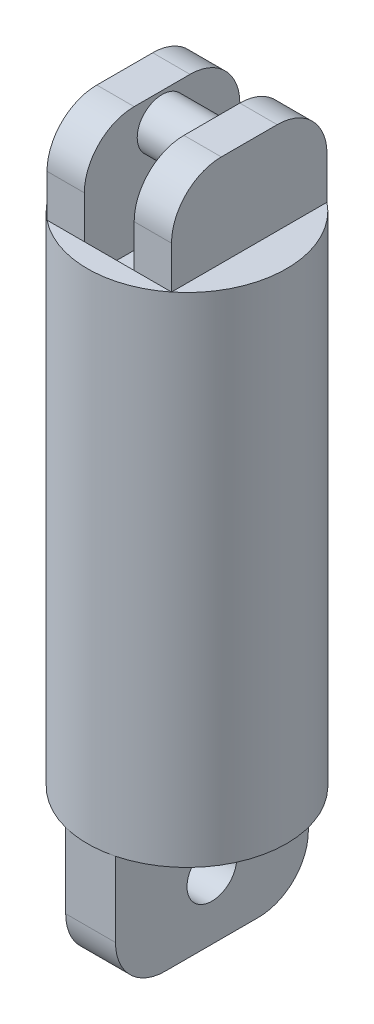
ISO-10303-21;
HEADER;
FILE_DESCRIPTION(('STEP AP214'),'2;1');
FILE_NAME('part.step','',(''),(''),'','','');
FILE_SCHEMA(('AUTOMOTIVE_DESIGN { 1 0 10303 214 1 1 1 1 }'));
ENDSEC;
DATA;
#1=APPLICATION_CONTEXT('core data for automotive mechanical design processes');
#2=APPLICATION_PROTOCOL_DEFINITION('international standard','automotive_design',2000,#1);
#3=PRODUCT_CONTEXT('',#1,'mechanical');
#4=PRODUCT('Part','Part','',(#3));
#5=PRODUCT_RELATED_PRODUCT_CATEGORY('part','',(#4));
#6=PRODUCT_DEFINITION_FORMATION('','',#4);
#7=PRODUCT_DEFINITION_CONTEXT('part definition',#1,'design');
#8=PRODUCT_DEFINITION('design','',#6,#7);
#9=PRODUCT_DEFINITION_SHAPE('','',#8);
#10=(LENGTH_UNIT() NAMED_UNIT(*) SI_UNIT(.MILLI.,.METRE.));
#11=(NAMED_UNIT(*) PLANE_ANGLE_UNIT() SI_UNIT($,.RADIAN.));
#12=(NAMED_UNIT(*) SI_UNIT($,.STERADIAN.) SOLID_ANGLE_UNIT());
#13=UNCERTAINTY_MEASURE_WITH_UNIT(LENGTH_MEASURE(1.E-05),#10,'distance_accuracy_value','');
#14=(GEOMETRIC_REPRESENTATION_CONTEXT(3) GLOBAL_UNCERTAINTY_ASSIGNED_CONTEXT((#13)) GLOBAL_UNIT_ASSIGNED_CONTEXT((#10,
#11,#12)) REPRESENTATION_CONTEXT('',''));
#15=CARTESIAN_POINT('',(0.,0.,0.));
#16=DIRECTION('',(0.,0.,1.));
#17=DIRECTION('',(1.,0.,0.));
#18=AXIS2_PLACEMENT_3D('',#15,#16,#17);
#19=CARTESIAN_POINT('',(0.,0.,0.));
#20=DIRECTION('',(0.,1.,0.));
#21=DIRECTION('',(0.,0.,1.));
#22=AXIS2_PLACEMENT_3D('',#19,#20,#21);
#23=PLANE('',#22);
#24=DIRECTION('',(0.,0.,1.));
#25=VECTOR('',#24,1.);
#26=CARTESIAN_POINT('',(12.7,0.,-49.1868884968342));
#27=LINE('',#26,#25);
#28=CARTESIAN_POINT('',(12.7,0.,-49.1868884968342));
#29=VERTEX_POINT('',#28);
#30=CARTESIAN_POINT('',(12.7,0.,49.1868884968342));
#31=VERTEX_POINT('',#30);
#32=EDGE_CURVE('E226',#29,#31,#27,.T.);
#33=ORIENTED_EDGE('',*,*,#32,.F.);
#34=CARTESIAN_POINT('',(0.,0.,0.));
#35=DIRECTION('',(0.,1.,0.));
#36=DIRECTION('',(0.,0.,1.));
#37=AXIS2_PLACEMENT_3D('',#34,#35,#36);
#38=CIRCLE('',#37,50.8);
#39=EDGE_CURVE('E219',#31,#29,#38,.T.);
#40=ORIENTED_EDGE('',*,*,#39,.F.);
#41=EDGE_LOOP('',(#33,#40));
#42=FACE_BOUND('',#41,.T.);
#43=ADVANCED_FACE('F47',(#42),#23,.F.);
#44=DIRECTION('',(1.,0.,0.));
#45=VECTOR('',#44,1.);
#46=CARTESIAN_POINT('',(-12.7,0.,-49.1868884968342));
#47=LINE('',#46,#45);
#48=CARTESIAN_POINT('',(-12.7,0.,-49.1868884968342));
#49=VERTEX_POINT('',#48);
#50=EDGE_CURVE('E222',#49,#29,#47,.T.);
#51=ORIENTED_EDGE('',*,*,#50,.F.);
#52=EDGE_CURVE('E209',#29,#49,#38,.T.);
#53=ORIENTED_EDGE('',*,*,#52,.F.);
#54=EDGE_LOOP('',(#51,#53));
#55=FACE_BOUND('',#54,.T.);
#56=ADVANCED_FACE('F439',(#55),#23,.F.);
#57=DIRECTION('',(0.,0.,-1.));
#58=VECTOR('',#57,1.);
#59=CARTESIAN_POINT('',(-12.7,0.,-49.1868884968342));
#60=LINE('',#59,#58);
#61=CARTESIAN_POINT('',(-12.7,0.,49.1868884968342));
#62=VERTEX_POINT('',#61);
#63=EDGE_CURVE('E191',#62,#49,#60,.T.);
#64=ORIENTED_EDGE('',*,*,#63,.F.);
#65=EDGE_CURVE('E202',#49,#62,#38,.T.);
#66=ORIENTED_EDGE('',*,*,#65,.F.);
#67=EDGE_LOOP('',(#64,#66));
#68=FACE_BOUND('',#67,.T.);
#69=ADVANCED_FACE('F220',(#68),#23,.F.);
#70=DIRECTION('',(-1.,0.,0.));
#71=VECTOR('',#70,1.);
#72=CARTESIAN_POINT('',(-12.7,0.,49.1868884968342));
#73=LINE('',#72,#71);
#74=EDGE_CURVE('E216',#31,#62,#73,.T.);
#75=ORIENTED_EDGE('',*,*,#74,.F.);
#76=EDGE_CURVE('E206',#62,#31,#38,.T.);
#77=ORIENTED_EDGE('',*,*,#76,.F.);
#78=EDGE_LOOP('',(#75,#77));
#79=FACE_BOUND('',#78,.T.);
#80=ADVANCED_FACE('F215',(#79),#23,.F.);
#81=CARTESIAN_POINT('',(-31.75,300.99,-39.6557372898298));
#82=DIRECTION('',(0.,0.,1.));
#83=DIRECTION('',(1.,0.,0.));
#84=AXIS2_PLACEMENT_3D('',#81,#82,#83);
#85=PLANE('',#84);
#86=DIRECTION('',(0.,1.,0.));
#87=VECTOR('',#86,1.);
#88=CARTESIAN_POINT('',(12.7,237.49,-39.6557372898298));
#89=LINE('',#88,#87);
#90=CARTESIAN_POINT('',(12.7,254.,-39.6557372898298));
#91=VERTEX_POINT('',#90);
#92=CARTESIAN_POINT('',(12.7,275.59,-39.6557372898298));
#93=VERTEX_POINT('',#92);
#94=EDGE_CURVE('E264',#91,#93,#89,.T.);
#95=ORIENTED_EDGE('',*,*,#94,.T.);
#96=DIRECTION('',(-1.,0.,0.));
#97=VECTOR('',#96,1.);
#98=CARTESIAN_POINT('',(-31.75,275.59,-39.6557372898298));
#99=LINE('',#98,#97);
#100=CARTESIAN_POINT('',(31.75,275.59,-39.6557372898298));
#101=VERTEX_POINT('',#100);
#102=EDGE_CURVE('E380',#93,#101,#99,.F.);
#103=ORIENTED_EDGE('',*,*,#102,.T.);
#104=DIRECTION('',(0.,-1.,0.));
#105=VECTOR('',#104,1.);
#106=CARTESIAN_POINT('',(31.75,300.99,-39.6557372898298));
#107=LINE('',#106,#105);
#108=CARTESIAN_POINT('',(31.75,254.,-39.6557372898298));
#109=VERTEX_POINT('',#108);
#110=EDGE_CURVE('E218',#101,#109,#107,.T.);
#111=ORIENTED_EDGE('',*,*,#110,.T.);
#112=DIRECTION('',(-1.,0.,0.));
#113=VECTOR('',#112,1.);
#114=CARTESIAN_POINT('',(-31.75,254.,-39.6557372898298));
#115=LINE('',#114,#113);
#116=EDGE_CURVE('E311',#109,#91,#115,.T.);
#117=ORIENTED_EDGE('',*,*,#116,.T.);
#118=EDGE_LOOP('',(#95,#103,#111,#117));
#119=FACE_BOUND('',#118,.T.);
#120=ADVANCED_FACE('F451',(#119),#85,.F.);
#121=CARTESIAN_POINT('',(-31.75,300.99,39.6557372898298));
#122=DIRECTION('',(0.,0.,-1.));
#123=DIRECTION('',(-1.,0.,0.));
#124=AXIS2_PLACEMENT_3D('',#121,#122,#123);
#125=PLANE('',#124);
#126=DIRECTION('',(0.,-1.,0.));
#127=VECTOR('',#126,1.);
#128=CARTESIAN_POINT('',(31.75,300.99,39.6557372898298));
#129=LINE('',#128,#127);
#130=CARTESIAN_POINT('',(31.75,275.59,39.6557372898298));
#131=VERTEX_POINT('',#130);
#132=CARTESIAN_POINT('',(31.75,254.,39.6557372898298));
#133=VERTEX_POINT('',#132);
#134=EDGE_CURVE('E306',#131,#133,#129,.T.);
#135=ORIENTED_EDGE('',*,*,#134,.F.);
#136=DIRECTION('',(1.,0.,0.));
#137=VECTOR('',#136,1.);
#138=CARTESIAN_POINT('',(-31.75,275.59,39.6557372898298));
#139=LINE('',#138,#137);
#140=CARTESIAN_POINT('',(12.7,275.59,39.6557372898298));
#141=VERTEX_POINT('',#140);
#142=EDGE_CURVE('E389',#131,#141,#139,.F.);
#143=ORIENTED_EDGE('',*,*,#142,.T.);
#144=DIRECTION('',(0.,1.,0.));
#145=VECTOR('',#144,1.);
#146=CARTESIAN_POINT('',(12.7,237.49,39.6557372898298));
#147=LINE('',#146,#145);
#148=CARTESIAN_POINT('',(12.7,254.,39.6557372898298));
#149=VERTEX_POINT('',#148);
#150=EDGE_CURVE('E276',#149,#141,#147,.T.);
#151=ORIENTED_EDGE('',*,*,#150,.F.);
#152=DIRECTION('',(1.,0.,0.));
#153=VECTOR('',#152,1.);
#154=CARTESIAN_POINT('',(-31.75,254.,39.6557372898298));
#155=LINE('',#154,#153);
#156=EDGE_CURVE('E319',#149,#133,#155,.T.);
#157=ORIENTED_EDGE('',*,*,#156,.T.);
#158=EDGE_LOOP('',(#135,#143,#151,#157));
#159=FACE_BOUND('',#158,.T.);
#160=ADVANCED_FACE('F457',(#159),#125,.F.);
#161=CARTESIAN_POINT('',(0.,300.99,0.));
#162=DIRECTION('',(0.,-1.,0.));
#163=DIRECTION('',(0.,0.,-1.));
#164=AXIS2_PLACEMENT_3D('',#161,#162,#163);
#165=PLANE('',#164);
#166=DIRECTION('',(0.,0.,-1.));
#167=VECTOR('',#166,1.);
#168=CARTESIAN_POINT('',(31.75,300.99,39.6557372898298));
#169=LINE('',#168,#167);
#170=CARTESIAN_POINT('',(31.75,300.99,14.2557372898298));
#171=VERTEX_POINT('',#170);
#172=CARTESIAN_POINT('',(31.75,300.99,-14.2557372898298));
#173=VERTEX_POINT('',#172);
#174=EDGE_CURVE('E297',#171,#173,#169,.T.);
#175=ORIENTED_EDGE('',*,*,#174,.T.);
#176=DIRECTION('',(-1.,0.,0.));
#177=VECTOR('',#176,1.);
#178=CARTESIAN_POINT('',(0.,300.99,-14.2557372898298));
#179=LINE('',#178,#177);
#180=CARTESIAN_POINT('',(12.7,300.99,-14.2557372898298));
#181=VERTEX_POINT('',#180);
#182=EDGE_CURVE('E370',#173,#181,#179,.T.);
#183=ORIENTED_EDGE('',*,*,#182,.T.);
#184=DIRECTION('',(0.,0.,-1.));
#185=VECTOR('',#184,1.);
#186=CARTESIAN_POINT('',(12.7,300.99,39.6557372898298));
#187=LINE('',#186,#185);
#188=CARTESIAN_POINT('',(12.7,300.99,14.2557372898298));
#189=VERTEX_POINT('',#188);
#190=EDGE_CURVE('E246',#189,#181,#187,.T.);
#191=ORIENTED_EDGE('',*,*,#190,.F.);
#192=DIRECTION('',(1.,0.,0.));
#193=VECTOR('',#192,1.);
#194=CARTESIAN_POINT('',(0.,300.99,14.2557372898298));
#195=LINE('',#194,#193);
#196=EDGE_CURVE('E366',#189,#171,#195,.T.);
#197=ORIENTED_EDGE('',*,*,#196,.T.);
#198=EDGE_LOOP('',(#175,#183,#191,#197));
#199=FACE_BOUND('',#198,.T.);
#200=ADVANCED_FACE('F616',(#199),#165,.F.);
#201=CARTESIAN_POINT('',(0.,254.,0.));
#202=DIRECTION('',(0.,1.,0.));
#203=DIRECTION('',(0.,0.,1.));
#204=AXIS2_PLACEMENT_3D('',#201,#202,#203);
#205=PLANE('',#204);
#206=DIRECTION('',(0.,0.,-1.));
#207=VECTOR('',#206,1.);
#208=CARTESIAN_POINT('',(31.75,254.,39.6557372898298));
#209=LINE('',#208,#207);
#210=EDGE_CURVE('E296',#133,#109,#209,.T.);
#211=ORIENTED_EDGE('',*,*,#210,.F.);
#212=CARTESIAN_POINT('',(0.,254.,0.));
#213=DIRECTION('',(0.,1.,0.));
#214=DIRECTION('',(0.,0.,1.));
#215=AXIS2_PLACEMENT_3D('',#212,#213,#214);
#216=CIRCLE('',#215,50.8);
#217=EDGE_CURVE('E333',#133,#109,#216,.T.);
#218=ORIENTED_EDGE('',*,*,#217,.T.);
#219=EDGE_LOOP('',(#211,#218));
#220=FACE_BOUND('',#219,.T.);
#221=ADVANCED_FACE('F577',(#220),#205,.T.);
#222=CARTESIAN_POINT('',(-31.75,254.,39.6557372898298));
#223=VERTEX_POINT('',#222);
#224=CARTESIAN_POINT('',(-12.7,254.,39.6557372898298));
#225=VERTEX_POINT('',#224);
#226=EDGE_CURVE('E302',#223,#225,#155,.T.);
#227=ORIENTED_EDGE('',*,*,#226,.F.);
#228=EDGE_CURVE('E338',#223,#133,#216,.T.);
#229=ORIENTED_EDGE('',*,*,#228,.T.);
#230=ORIENTED_EDGE('',*,*,#156,.F.);
#231=DIRECTION('',(1.,0.,0.));
#232=VECTOR('',#231,1.);
#233=CARTESIAN_POINT('',(0.,254.,39.6557372898298));
#234=LINE('',#233,#232);
#235=EDGE_CURVE('E293',#225,#149,#234,.T.);
#236=ORIENTED_EDGE('',*,*,#235,.F.);
#237=EDGE_LOOP('',(#227,#229,#230,#236));
#238=FACE_BOUND('',#237,.T.);
#239=ADVANCED_FACE('F712',(#238),#205,.T.);
#240=DIRECTION('',(0.,0.,1.));
#241=VECTOR('',#240,1.);
#242=CARTESIAN_POINT('',(-31.75,254.,39.6557372898298));
#243=LINE('',#242,#241);
#244=CARTESIAN_POINT('',(-31.75,254.,-39.6557372898298));
#245=VERTEX_POINT('',#244);
#246=EDGE_CURVE('E315',#245,#223,#243,.T.);
#247=ORIENTED_EDGE('',*,*,#246,.F.);
#248=EDGE_CURVE('E783',#245,#223,#216,.T.);
#249=ORIENTED_EDGE('',*,*,#248,.T.);
#250=EDGE_LOOP('',(#247,#249));
#251=FACE_BOUND('',#250,.T.);
#252=ADVANCED_FACE('F705',(#251),#205,.T.);
#253=CARTESIAN_POINT('',(0.,254.,0.));
#254=DIRECTION('',(0.,-1.,0.));
#255=DIRECTION('',(0.,0.,-1.));
#256=AXIS2_PLACEMENT_3D('',#253,#254,#255);
#257=CYLINDRICAL_SURFACE('',#256,50.8);
#258=ORIENTED_EDGE('',*,*,#217,.F.);
#259=ORIENTED_EDGE('',*,*,#228,.F.);
#260=ORIENTED_EDGE('',*,*,#248,.F.);
#261=EDGE_CURVE('E337',#109,#245,#216,.T.);
#262=ORIENTED_EDGE('',*,*,#261,.F.);
#263=EDGE_LOOP('',(#258,#259,#260,#262));
#264=FACE_BOUND('',#263,.T.);
#265=ORIENTED_EDGE('',*,*,#39,.T.);
#266=ORIENTED_EDGE('',*,*,#52,.T.);
#267=ORIENTED_EDGE('',*,*,#65,.T.);
#268=ORIENTED_EDGE('',*,*,#76,.T.);
#269=EDGE_LOOP('',(#265,#266,#267,#268));
#270=FACE_BOUND('',#269,.T.);
#271=ADVANCED_FACE('F205',(#264,#270),#257,.T.);
#272=ORIENTED_EDGE('',*,*,#116,.F.);
#273=ORIENTED_EDGE('',*,*,#261,.T.);
#274=CARTESIAN_POINT('',(-12.7,254.,-39.6557372898298));
#275=VERTEX_POINT('',#274);
#276=EDGE_CURVE('E310',#275,#245,#115,.T.);
#277=ORIENTED_EDGE('',*,*,#276,.F.);
#278=DIRECTION('',(-1.,0.,0.));
#279=VECTOR('',#278,1.);
#280=CARTESIAN_POINT('',(0.,254.,-39.6557372898298));
#281=LINE('',#280,#279);
#282=EDGE_CURVE('E275',#91,#275,#281,.T.);
#283=ORIENTED_EDGE('',*,*,#282,.F.);
#284=EDGE_LOOP('',(#272,#273,#277,#283));
#285=FACE_BOUND('',#284,.T.);
#286=ADVANCED_FACE('F565',(#285),#205,.T.);
#287=CARTESIAN_POINT('',(31.75,300.99,39.6557372898298));
#288=DIRECTION('',(-1.,0.,0.));
#289=DIRECTION('',(0.,0.,1.));
#290=AXIS2_PLACEMENT_3D('',#287,#288,#289);
#291=PLANE('',#290);
#292=ORIENTED_EDGE('',*,*,#110,.F.);
#293=CARTESIAN_POINT('',(31.75,275.59,-14.2557372898298));
#294=DIRECTION('',(-1.,0.,0.));
#295=DIRECTION('',(0.,0.,1.));
#296=AXIS2_PLACEMENT_3D('',#293,#294,#295);
#297=CIRCLE('',#296,25.4);
#298=EDGE_CURVE('E386',#101,#173,#297,.F.);
#299=ORIENTED_EDGE('',*,*,#298,.T.);
#300=ORIENTED_EDGE('',*,*,#174,.F.);
#301=CARTESIAN_POINT('',(31.75,275.59,14.2557372898298));
#302=DIRECTION('',(-1.,0.,0.));
#303=DIRECTION('',(0.,0.,1.));
#304=AXIS2_PLACEMENT_3D('',#301,#302,#303);
#305=CIRCLE('',#304,25.4);
#306=EDGE_CURVE('E383',#171,#131,#305,.F.);
#307=ORIENTED_EDGE('',*,*,#306,.T.);
#308=ORIENTED_EDGE('',*,*,#134,.T.);
#309=ORIENTED_EDGE('',*,*,#210,.T.);
#310=EDGE_LOOP('',(#292,#299,#300,#307,#308,#309));
#311=FACE_BOUND('',#310,.T.);
#312=ADVANCED_FACE('F562',(#311),#291,.F.);
#313=DIRECTION('',(0.,-1.,0.));
#314=VECTOR('',#313,1.);
#315=CARTESIAN_POINT('',(-31.75,300.99,-39.6557372898298));
#316=LINE('',#315,#314);
#317=CARTESIAN_POINT('',(-31.75,275.59,-39.6557372898298));
#318=VERTEX_POINT('',#317);
#319=EDGE_CURVE('E328',#318,#245,#316,.T.);
#320=ORIENTED_EDGE('',*,*,#319,.F.);
#321=DIRECTION('',(-1.,0.,0.));
#322=VECTOR('',#321,1.);
#323=CARTESIAN_POINT('',(-31.75,275.59,-39.6557372898298));
#324=LINE('',#323,#322);
#325=CARTESIAN_POINT('',(-12.7,275.59,-39.6557372898298));
#326=VERTEX_POINT('',#325);
#327=EDGE_CURVE('E354',#318,#326,#324,.F.);
#328=ORIENTED_EDGE('',*,*,#327,.T.);
#329=DIRECTION('',(0.,1.,0.));
#330=VECTOR('',#329,1.);
#331=CARTESIAN_POINT('',(-12.7,237.49,-39.6557372898298));
#332=LINE('',#331,#330);
#333=EDGE_CURVE('E286',#275,#326,#332,.T.);
#334=ORIENTED_EDGE('',*,*,#333,.F.);
#335=ORIENTED_EDGE('',*,*,#276,.T.);
#336=EDGE_LOOP('',(#320,#328,#334,#335));
#337=FACE_BOUND('',#336,.T.);
#338=ADVANCED_FACE('F460',(#337),#85,.F.);
#339=CARTESIAN_POINT('',(-31.75,300.99,39.6557372898298));
#340=DIRECTION('',(1.,0.,0.));
#341=DIRECTION('',(0.,0.,-1.));
#342=AXIS2_PLACEMENT_3D('',#339,#340,#341);
#343=PLANE('',#342);
#344=DIRECTION('',(0.,0.,1.));
#345=VECTOR('',#344,1.);
#346=CARTESIAN_POINT('',(-31.75,300.99,39.6557372898298));
#347=LINE('',#346,#345);
#348=CARTESIAN_POINT('',(-31.75,300.99,-14.2557372898298));
#349=VERTEX_POINT('',#348);
#350=CARTESIAN_POINT('',(-31.75,300.99,14.2557372898298));
#351=VERTEX_POINT('',#350);
#352=EDGE_CURVE('E301',#349,#351,#347,.T.);
#353=ORIENTED_EDGE('',*,*,#352,.F.);
#354=CARTESIAN_POINT('',(-31.75,275.59,-14.2557372898298));
#355=DIRECTION('',(1.,0.,0.));
#356=DIRECTION('',(0.,0.,-1.));
#357=AXIS2_PLACEMENT_3D('',#354,#355,#356);
#358=CIRCLE('',#357,25.4);
#359=EDGE_CURVE('E351',#349,#318,#358,.F.);
#360=ORIENTED_EDGE('',*,*,#359,.T.);
#361=ORIENTED_EDGE('',*,*,#319,.T.);
#362=ORIENTED_EDGE('',*,*,#246,.T.);
#363=DIRECTION('',(0.,-1.,0.));
#364=VECTOR('',#363,1.);
#365=CARTESIAN_POINT('',(-31.75,300.99,39.6557372898298));
#366=LINE('',#365,#364);
#367=CARTESIAN_POINT('',(-31.75,275.59,39.6557372898298));
#368=VERTEX_POINT('',#367);
#369=EDGE_CURVE('E325',#368,#223,#366,.T.);
#370=ORIENTED_EDGE('',*,*,#369,.F.);
#371=CARTESIAN_POINT('',(-31.75,275.59,14.2557372898298));
#372=DIRECTION('',(1.,0.,0.));
#373=DIRECTION('',(0.,0.,-1.));
#374=AXIS2_PLACEMENT_3D('',#371,#372,#373);
#375=CIRCLE('',#374,25.4);
#376=EDGE_CURVE('E348',#368,#351,#375,.F.);
#377=ORIENTED_EDGE('',*,*,#376,.T.);
#378=EDGE_LOOP('',(#353,#360,#361,#362,#370,#377));
#379=FACE_BOUND('',#378,.T.);
#380=ADVANCED_FACE('F585',(#379),#343,.F.);
#381=DIRECTION('',(0.,1.,0.));
#382=VECTOR('',#381,1.);
#383=CARTESIAN_POINT('',(-12.7,237.49,39.6557372898298));
#384=LINE('',#383,#382);
#385=CARTESIAN_POINT('',(-12.7,275.59,39.6557372898298));
#386=VERTEX_POINT('',#385);
#387=EDGE_CURVE('E281',#225,#386,#384,.T.);
#388=ORIENTED_EDGE('',*,*,#387,.T.);
#389=DIRECTION('',(1.,0.,0.));
#390=VECTOR('',#389,1.);
#391=CARTESIAN_POINT('',(-31.75,275.59,39.6557372898298));
#392=LINE('',#391,#390);
#393=EDGE_CURVE('E363',#386,#368,#392,.F.);
#394=ORIENTED_EDGE('',*,*,#393,.T.);
#395=ORIENTED_EDGE('',*,*,#369,.T.);
#396=ORIENTED_EDGE('',*,*,#226,.T.);
#397=EDGE_LOOP('',(#388,#394,#395,#396));
#398=FACE_BOUND('',#397,.T.);
#399=ADVANCED_FACE('F595',(#398),#125,.F.);
#400=DIRECTION('',(0.,0.,1.));
#401=VECTOR('',#400,1.);
#402=CARTESIAN_POINT('',(-12.7,300.99,39.6557372898298));
#403=LINE('',#402,#401);
#404=CARTESIAN_POINT('',(-12.7,300.99,-14.2557372898298));
#405=VERTEX_POINT('',#404);
#406=CARTESIAN_POINT('',(-12.7,300.99,14.2557372898298));
#407=VERTEX_POINT('',#406);
#408=EDGE_CURVE('E252',#405,#407,#403,.T.);
#409=ORIENTED_EDGE('',*,*,#408,.F.);
#410=DIRECTION('',(-1.,0.,0.));
#411=VECTOR('',#410,1.);
#412=CARTESIAN_POINT('',(0.,300.99,-14.2557372898298));
#413=LINE('',#412,#411);
#414=EDGE_CURVE('E344',#405,#349,#413,.T.);
#415=ORIENTED_EDGE('',*,*,#414,.T.);
#416=ORIENTED_EDGE('',*,*,#352,.T.);
#417=DIRECTION('',(1.,0.,0.));
#418=VECTOR('',#417,1.);
#419=CARTESIAN_POINT('',(0.,300.99,14.2557372898298));
#420=LINE('',#419,#418);
#421=EDGE_CURVE('E336',#351,#407,#420,.T.);
#422=ORIENTED_EDGE('',*,*,#421,.T.);
#423=EDGE_LOOP('',(#409,#415,#416,#422));
#424=FACE_BOUND('',#423,.T.);
#425=ADVANCED_FACE('F555',(#424),#165,.F.);
#426=CARTESIAN_POINT('',(12.7,237.49,39.6557372898298));
#427=DIRECTION('',(1.,0.,0.));
#428=DIRECTION('',(0.,0.,-1.));
#429=AXIS2_PLACEMENT_3D('',#426,#427,#428);
#430=PLANE('',#429);
#431=CARTESIAN_POINT('',(12.7,286.494432143543,0.));
#432=DIRECTION('',(1.,0.,0.));
#433=DIRECTION('',(0.,0.,-1.));
#434=AXIS2_PLACEMENT_3D('',#431,#432,#433);
#435=CIRCLE('',#434,12.7);
#436=CARTESIAN_POINT('',(12.7,286.494432143543,-12.7));
#437=VERTEX_POINT('',#436);
#438=EDGE_CURVE('E749',#437,#437,#435,.T.);
#439=ORIENTED_EDGE('',*,*,#438,.T.);
#440=EDGE_LOOP('',(#439));
#441=FACE_BOUND('',#440,.T.);
#442=ORIENTED_EDGE('',*,*,#190,.T.);
#443=CARTESIAN_POINT('',(12.7,275.59,-14.2557372898298));
#444=DIRECTION('',(1.,0.,0.));
#445=DIRECTION('',(0.,0.,-1.));
#446=AXIS2_PLACEMENT_3D('',#443,#444,#445);
#447=CIRCLE('',#446,25.4);
#448=EDGE_CURVE('E377',#181,#93,#447,.F.);
#449=ORIENTED_EDGE('',*,*,#448,.T.);
#450=ORIENTED_EDGE('',*,*,#94,.F.);
#451=CARTESIAN_POINT('',(12.7,237.49,-39.6557372898298));
#452=VERTEX_POINT('',#451);
#453=EDGE_CURVE('E287',#452,#91,#89,.T.);
#454=ORIENTED_EDGE('',*,*,#453,.F.);
#455=DIRECTION('',(0.,0.,-1.));
#456=VECTOR('',#455,1.);
#457=CARTESIAN_POINT('',(12.7,237.49,39.6557372898298));
#458=LINE('',#457,#456);
#459=CARTESIAN_POINT('',(12.7,237.49,39.6557372898298));
#460=VERTEX_POINT('',#459);
#461=EDGE_CURVE('E247',#460,#452,#458,.T.);
#462=ORIENTED_EDGE('',*,*,#461,.F.);
#463=EDGE_CURVE('E271',#460,#149,#147,.T.);
#464=ORIENTED_EDGE('',*,*,#463,.T.);
#465=ORIENTED_EDGE('',*,*,#150,.T.);
#466=CARTESIAN_POINT('',(12.7,275.59,14.2557372898298));
#467=DIRECTION('',(1.,0.,0.));
#468=DIRECTION('',(0.,0.,-1.));
#469=AXIS2_PLACEMENT_3D('',#466,#467,#468);
#470=CIRCLE('',#469,25.4);
#471=EDGE_CURVE('E374',#141,#189,#470,.F.);
#472=ORIENTED_EDGE('',*,*,#471,.T.);
#473=EDGE_LOOP('',(#442,#449,#450,#454,#462,#464,#465,#472));
#474=FACE_BOUND('',#473,.T.);
#475=ADVANCED_FACE('F551',(#441,#474),#430,.F.);
#476=CARTESIAN_POINT('',(-12.7,237.49,39.6557372898298));
#477=DIRECTION('',(0.,0.,1.));
#478=DIRECTION('',(1.,0.,0.));
#479=AXIS2_PLACEMENT_3D('',#476,#477,#478);
#480=PLANE('',#479);
#481=ORIENTED_EDGE('',*,*,#235,.T.);
#482=ORIENTED_EDGE('',*,*,#463,.F.);
#483=DIRECTION('',(1.,0.,0.));
#484=VECTOR('',#483,1.);
#485=CARTESIAN_POINT('',(-12.7,237.49,39.6557372898298));
#486=LINE('',#485,#484);
#487=CARTESIAN_POINT('',(-12.7,237.49,39.6557372898298));
#488=VERTEX_POINT('',#487);
#489=EDGE_CURVE('E260',#488,#460,#486,.T.);
#490=ORIENTED_EDGE('',*,*,#489,.F.);
#491=EDGE_CURVE('E277',#488,#225,#384,.T.);
#492=ORIENTED_EDGE('',*,*,#491,.T.);
#493=EDGE_LOOP('',(#481,#482,#490,#492));
#494=FACE_BOUND('',#493,.T.);
#495=ADVANCED_FACE('F543',(#494),#480,.F.);
#496=CARTESIAN_POINT('',(-12.7,237.49,39.6557372898298));
#497=DIRECTION('',(-1.,0.,0.));
#498=DIRECTION('',(0.,0.,1.));
#499=AXIS2_PLACEMENT_3D('',#496,#497,#498);
#500=PLANE('',#499);
#501=CARTESIAN_POINT('',(-12.7,286.494432143543,0.));
#502=DIRECTION('',(-1.,0.,0.));
#503=DIRECTION('',(0.,0.,1.));
#504=AXIS2_PLACEMENT_3D('',#501,#502,#503);
#505=CIRCLE('',#504,12.7);
#506=CARTESIAN_POINT('',(-12.7,286.494432143543,12.7));
#507=VERTEX_POINT('',#506);
#508=EDGE_CURVE('E51',#507,#507,#505,.T.);
#509=ORIENTED_EDGE('',*,*,#508,.T.);
#510=EDGE_LOOP('',(#509));
#511=FACE_BOUND('',#510,.T.);
#512=ORIENTED_EDGE('',*,*,#333,.T.);
#513=CARTESIAN_POINT('',(-12.7,275.59,-14.2557372898298));
#514=DIRECTION('',(-1.,0.,0.));
#515=DIRECTION('',(0.,0.,1.));
#516=AXIS2_PLACEMENT_3D('',#513,#514,#515);
#517=CIRCLE('',#516,25.4);
#518=EDGE_CURVE('E360',#326,#405,#517,.F.);
#519=ORIENTED_EDGE('',*,*,#518,.T.);
#520=ORIENTED_EDGE('',*,*,#408,.T.);
#521=CARTESIAN_POINT('',(-12.7,275.59,14.2557372898298));
#522=DIRECTION('',(-1.,0.,0.));
#523=DIRECTION('',(0.,0.,1.));
#524=AXIS2_PLACEMENT_3D('',#521,#522,#523);
#525=CIRCLE('',#524,25.4);
#526=EDGE_CURVE('E357',#407,#386,#525,.F.);
#527=ORIENTED_EDGE('',*,*,#526,.T.);
#528=ORIENTED_EDGE('',*,*,#387,.F.);
#529=ORIENTED_EDGE('',*,*,#491,.F.);
#530=DIRECTION('',(0.,0.,1.));
#531=VECTOR('',#530,1.);
#532=CARTESIAN_POINT('',(-12.7,237.49,39.6557372898298));
#533=LINE('',#532,#531);
#534=CARTESIAN_POINT('',(-12.7,237.49,-39.6557372898298));
#535=VERTEX_POINT('',#534);
#536=EDGE_CURVE('E256',#535,#488,#533,.T.);
#537=ORIENTED_EDGE('',*,*,#536,.F.);
#538=EDGE_CURVE('E282',#535,#275,#332,.T.);
#539=ORIENTED_EDGE('',*,*,#538,.T.);
#540=EDGE_LOOP('',(#512,#519,#520,#527,#528,#529,#537,#539));
#541=FACE_BOUND('',#540,.T.);
#542=ADVANCED_FACE('F538',(#511,#541),#500,.F.);
#543=CARTESIAN_POINT('',(-12.7,237.49,-39.6557372898298));
#544=DIRECTION('',(0.,0.,-1.));
#545=DIRECTION('',(-1.,0.,0.));
#546=AXIS2_PLACEMENT_3D('',#543,#544,#545);
#547=PLANE('',#546);
#548=ORIENTED_EDGE('',*,*,#282,.T.);
#549=ORIENTED_EDGE('',*,*,#538,.F.);
#550=DIRECTION('',(-1.,0.,0.));
#551=VECTOR('',#550,1.);
#552=CARTESIAN_POINT('',(-12.7,237.49,-39.6557372898298));
#553=LINE('',#552,#551);
#554=EDGE_CURVE('E251',#452,#535,#553,.T.);
#555=ORIENTED_EDGE('',*,*,#554,.F.);
#556=ORIENTED_EDGE('',*,*,#453,.T.);
#557=EDGE_LOOP('',(#548,#549,#555,#556));
#558=FACE_BOUND('',#557,.T.);
#559=ADVANCED_FACE('F542',(#558),#547,.F.);
#560=CARTESIAN_POINT('',(0.,237.49,0.));
#561=DIRECTION('',(0.,-1.,0.));
#562=DIRECTION('',(0.,0.,-1.));
#563=AXIS2_PLACEMENT_3D('',#560,#561,#562);
#564=PLANE('',#563);
#565=ORIENTED_EDGE('',*,*,#461,.T.);
#566=ORIENTED_EDGE('',*,*,#554,.T.);
#567=ORIENTED_EDGE('',*,*,#536,.T.);
#568=ORIENTED_EDGE('',*,*,#489,.T.);
#569=EDGE_LOOP('',(#565,#566,#567,#568));
#570=FACE_BOUND('',#569,.T.);
#571=ADVANCED_FACE('F651',(#570),#564,.F.);
#572=CARTESIAN_POINT('',(0.,275.59,-14.2557372898298));
#573=DIRECTION('',(-1.,0.,0.));
#574=DIRECTION('',(0.,0.,1.));
#575=AXIS2_PLACEMENT_3D('',#572,#573,#574);
#576=CYLINDRICAL_SURFACE('',#575,25.4);
#577=ORIENTED_EDGE('',*,*,#518,.F.);
#578=ORIENTED_EDGE('',*,*,#327,.F.);
#579=ORIENTED_EDGE('',*,*,#359,.F.);
#580=ORIENTED_EDGE('',*,*,#414,.F.);
#581=EDGE_LOOP('',(#577,#578,#579,#580));
#582=FACE_BOUND('',#581,.T.);
#583=ADVANCED_FACE('F659',(#582),#576,.T.);
#584=CARTESIAN_POINT('',(0.,275.59,14.2557372898298));
#585=DIRECTION('',(1.,0.,0.));
#586=DIRECTION('',(0.,0.,-1.));
#587=AXIS2_PLACEMENT_3D('',#584,#585,#586);
#588=CYLINDRICAL_SURFACE('',#587,25.4);
#589=ORIENTED_EDGE('',*,*,#376,.F.);
#590=ORIENTED_EDGE('',*,*,#393,.F.);
#591=ORIENTED_EDGE('',*,*,#526,.F.);
#592=ORIENTED_EDGE('',*,*,#421,.F.);
#593=EDGE_LOOP('',(#589,#590,#591,#592));
#594=FACE_BOUND('',#593,.T.);
#595=ADVANCED_FACE('F667',(#594),#588,.T.);
#596=CARTESIAN_POINT('',(0.,275.59,-14.2557372898298));
#597=DIRECTION('',(-1.,0.,0.));
#598=DIRECTION('',(0.,0.,1.));
#599=AXIS2_PLACEMENT_3D('',#596,#597,#598);
#600=CYLINDRICAL_SURFACE('',#599,25.4);
#601=ORIENTED_EDGE('',*,*,#298,.F.);
#602=ORIENTED_EDGE('',*,*,#102,.F.);
#603=ORIENTED_EDGE('',*,*,#448,.F.);
#604=ORIENTED_EDGE('',*,*,#182,.F.);
#605=EDGE_LOOP('',(#601,#602,#603,#604));
#606=FACE_BOUND('',#605,.T.);
#607=ADVANCED_FACE('F676',(#606),#600,.T.);
#608=CARTESIAN_POINT('',(0.,275.59,14.2557372898298));
#609=DIRECTION('',(1.,0.,0.));
#610=DIRECTION('',(0.,0.,-1.));
#611=AXIS2_PLACEMENT_3D('',#608,#609,#610);
#612=CYLINDRICAL_SURFACE('',#611,25.4);
#613=ORIENTED_EDGE('',*,*,#471,.F.);
#614=ORIENTED_EDGE('',*,*,#142,.F.);
#615=ORIENTED_EDGE('',*,*,#306,.F.);
#616=ORIENTED_EDGE('',*,*,#196,.F.);
#617=EDGE_LOOP('',(#613,#614,#615,#616));
#618=FACE_BOUND('',#617,.T.);
#619=ADVANCED_FACE('F480',(#618),#612,.T.);
#620=CARTESIAN_POINT('',(12.7,-63.5,-49.1868884968342));
#621=DIRECTION('',(-1.,0.,0.));
#622=DIRECTION('',(0.,0.,1.));
#623=AXIS2_PLACEMENT_3D('',#620,#621,#622);
#624=PLANE('',#623);
#625=CARTESIAN_POINT('',(12.7,-31.75,0.));
#626=DIRECTION('',(1.,0.,0.));
#627=DIRECTION('',(0.,0.,-1.));
#628=AXIS2_PLACEMENT_3D('',#625,#626,#627);
#629=CIRCLE('',#628,12.7);
#630=CARTESIAN_POINT('',(12.7,-31.75,-12.7));
#631=VERTEX_POINT('',#630);
#632=EDGE_CURVE('E396',#631,#631,#629,.T.);
#633=ORIENTED_EDGE('',*,*,#632,.F.);
#634=EDGE_LOOP('',(#633));
#635=FACE_BOUND('',#634,.T.);
#636=DIRECTION('',(0.,1.,0.));
#637=VECTOR('',#636,1.);
#638=CARTESIAN_POINT('',(12.7,-63.5,49.1868884968342));
#639=LINE('',#638,#637);
#640=CARTESIAN_POINT('',(12.7,-38.1,49.1868884968342));
#641=VERTEX_POINT('',#640);
#642=EDGE_CURVE('E195',#641,#31,#639,.T.);
#643=ORIENTED_EDGE('',*,*,#642,.F.);
#644=CARTESIAN_POINT('',(12.7,-38.1,23.7868884968342));
#645=DIRECTION('',(-1.,0.,0.));
#646=DIRECTION('',(0.,0.,1.));
#647=AXIS2_PLACEMENT_3D('',#644,#645,#646);
#648=CIRCLE('',#647,25.4);
#649=CARTESIAN_POINT('',(12.7,-63.5,23.7868884968342));
#650=VERTEX_POINT('',#649);
#651=EDGE_CURVE('E57',#641,#650,#648,.F.);
#652=ORIENTED_EDGE('',*,*,#651,.T.);
#653=DIRECTION('',(0.,0.,1.));
#654=VECTOR('',#653,1.);
#655=CARTESIAN_POINT('',(12.7,-63.5,-49.1868884968342));
#656=LINE('',#655,#654);
#657=CARTESIAN_POINT('',(12.7,-63.5,-23.7868884968342));
#658=VERTEX_POINT('',#657);
#659=EDGE_CURVE('E237',#658,#650,#656,.T.);
#660=ORIENTED_EDGE('',*,*,#659,.F.);
#661=CARTESIAN_POINT('',(12.7,-38.1,-23.7868884968342));
#662=DIRECTION('',(-1.,0.,0.));
#663=DIRECTION('',(0.,0.,1.));
#664=AXIS2_PLACEMENT_3D('',#661,#662,#663);
#665=CIRCLE('',#664,25.4);
#666=CARTESIAN_POINT('',(12.7,-38.1,-49.1868884968342));
#667=VERTEX_POINT('',#666);
#668=EDGE_CURVE('E64',#658,#667,#665,.F.);
#669=ORIENTED_EDGE('',*,*,#668,.T.);
#670=DIRECTION('',(0.,1.,0.));
#671=VECTOR('',#670,1.);
#672=CARTESIAN_POINT('',(12.7,-63.5,-49.1868884968342));
#673=LINE('',#672,#671);
#674=EDGE_CURVE('E238',#667,#29,#673,.T.);
#675=ORIENTED_EDGE('',*,*,#674,.T.);
#676=ORIENTED_EDGE('',*,*,#32,.T.);
#677=EDGE_LOOP('',(#643,#652,#660,#669,#675,#676));
#678=FACE_BOUND('',#677,.T.);
#679=ADVANCED_FACE('F416',(#635,#678),#624,.F.);
#680=CARTESIAN_POINT('',(-12.7,-63.5,49.1868884968342));
#681=DIRECTION('',(0.,0.,-1.));
#682=DIRECTION('',(-1.,0.,0.));
#683=AXIS2_PLACEMENT_3D('',#680,#681,#682);
#684=PLANE('',#683);
#685=DIRECTION('',(0.,1.,0.));
#686=VECTOR('',#685,1.);
#687=CARTESIAN_POINT('',(-12.7,-63.5,49.1868884968342));
#688=LINE('',#687,#686);
#689=CARTESIAN_POINT('',(-12.7,-38.1,49.1868884968342));
#690=VERTEX_POINT('',#689);
#691=EDGE_CURVE('E185',#690,#62,#688,.T.);
#692=ORIENTED_EDGE('',*,*,#691,.F.);
#693=DIRECTION('',(-1.,0.,0.));
#694=VECTOR('',#693,1.);
#695=CARTESIAN_POINT('',(-12.7,-38.1,49.1868884968342));
#696=LINE('',#695,#694);
#697=EDGE_CURVE('E72',#690,#641,#696,.F.);
#698=ORIENTED_EDGE('',*,*,#697,.T.);
#699=ORIENTED_EDGE('',*,*,#642,.T.);
#700=ORIENTED_EDGE('',*,*,#74,.T.);
#701=EDGE_LOOP('',(#692,#698,#699,#700));
#702=FACE_BOUND('',#701,.T.);
#703=ADVANCED_FACE('F224',(#702),#684,.F.);
#704=CARTESIAN_POINT('',(-12.7,-63.5,-49.1868884968342));
#705=DIRECTION('',(1.,0.,0.));
#706=DIRECTION('',(0.,0.,-1.));
#707=AXIS2_PLACEMENT_3D('',#704,#705,#706);
#708=PLANE('',#707);
#709=CARTESIAN_POINT('',(-12.7,-31.75,0.));
#710=DIRECTION('',(1.,0.,0.));
#711=DIRECTION('',(0.,0.,-1.));
#712=AXIS2_PLACEMENT_3D('',#709,#710,#711);
#713=CIRCLE('',#712,12.7);
#714=CARTESIAN_POINT('',(-12.7,-31.75,-12.7));
#715=VERTEX_POINT('',#714);
#716=EDGE_CURVE('E230',#715,#715,#713,.T.);
#717=ORIENTED_EDGE('',*,*,#716,.T.);
#718=EDGE_LOOP('',(#717));
#719=FACE_BOUND('',#718,.T.);
#720=DIRECTION('',(0.,0.,-1.));
#721=VECTOR('',#720,1.);
#722=CARTESIAN_POINT('',(-12.7,-63.5,-49.1868884968342));
#723=LINE('',#722,#721);
#724=CARTESIAN_POINT('',(-12.7,-63.5,23.7868884968342));
#725=VERTEX_POINT('',#724);
#726=CARTESIAN_POINT('',(-12.7,-63.5,-23.7868884968342));
#727=VERTEX_POINT('',#726);
#728=EDGE_CURVE('E241',#725,#727,#723,.T.);
#729=ORIENTED_EDGE('',*,*,#728,.F.);
#730=CARTESIAN_POINT('',(-12.7,-38.1,23.7868884968342));
#731=DIRECTION('',(1.,0.,0.));
#732=DIRECTION('',(0.,0.,-1.));
#733=AXIS2_PLACEMENT_3D('',#730,#731,#732);
#734=CIRCLE('',#733,25.4);
#735=EDGE_CURVE('E192',#725,#690,#734,.F.);
#736=ORIENTED_EDGE('',*,*,#735,.T.);
#737=ORIENTED_EDGE('',*,*,#691,.T.);
#738=ORIENTED_EDGE('',*,*,#63,.T.);
#739=DIRECTION('',(0.,1.,0.));
#740=VECTOR('',#739,1.);
#741=CARTESIAN_POINT('',(-12.7,-63.5,-49.1868884968342));
#742=LINE('',#741,#740);
#743=CARTESIAN_POINT('',(-12.7,-38.1,-49.1868884968342));
#744=VERTEX_POINT('',#743);
#745=EDGE_CURVE('E196',#744,#49,#742,.T.);
#746=ORIENTED_EDGE('',*,*,#745,.F.);
#747=CARTESIAN_POINT('',(-12.7,-38.1,-23.7868884968342));
#748=DIRECTION('',(1.,0.,0.));
#749=DIRECTION('',(0.,0.,-1.));
#750=AXIS2_PLACEMENT_3D('',#747,#748,#749);
#751=CIRCLE('',#750,25.4);
#752=EDGE_CURVE('E404',#744,#727,#751,.F.);
#753=ORIENTED_EDGE('',*,*,#752,.T.);
#754=EDGE_LOOP('',(#729,#736,#737,#738,#746,#753));
#755=FACE_BOUND('',#754,.T.);
#756=ADVANCED_FACE('F188',(#719,#755),#708,.F.);
#757=CARTESIAN_POINT('',(-12.7,-63.5,-49.1868884968342));
#758=DIRECTION('',(0.,0.,1.));
#759=DIRECTION('',(1.,0.,0.));
#760=AXIS2_PLACEMENT_3D('',#757,#758,#759);
#761=PLANE('',#760);
#762=ORIENTED_EDGE('',*,*,#674,.F.);
#763=DIRECTION('',(1.,0.,0.));
#764=VECTOR('',#763,1.);
#765=CARTESIAN_POINT('',(-12.7,-38.1,-49.1868884968342));
#766=LINE('',#765,#764);
#767=EDGE_CURVE('E11',#667,#744,#766,.F.);
#768=ORIENTED_EDGE('',*,*,#767,.T.);
#769=ORIENTED_EDGE('',*,*,#745,.T.);
#770=ORIENTED_EDGE('',*,*,#50,.T.);
#771=EDGE_LOOP('',(#762,#768,#769,#770));
#772=FACE_BOUND('',#771,.T.);
#773=ADVANCED_FACE('F496',(#772),#761,.F.);
#774=CARTESIAN_POINT('',(0.,-63.5,0.));
#775=DIRECTION('',(0.,1.,0.));
#776=DIRECTION('',(0.,0.,1.));
#777=AXIS2_PLACEMENT_3D('',#774,#775,#776);
#778=PLANE('',#777);
#779=ORIENTED_EDGE('',*,*,#659,.T.);
#780=DIRECTION('',(-1.,0.,0.));
#781=VECTOR('',#780,1.);
#782=CARTESIAN_POINT('',(0.,-63.5,23.7868884968342));
#783=LINE('',#782,#781);
#784=EDGE_CURVE('E400',#650,#725,#783,.T.);
#785=ORIENTED_EDGE('',*,*,#784,.T.);
#786=ORIENTED_EDGE('',*,*,#728,.T.);
#787=DIRECTION('',(1.,0.,0.));
#788=VECTOR('',#787,1.);
#789=CARTESIAN_POINT('',(0.,-63.5,-23.7868884968342));
#790=LINE('',#789,#788);
#791=EDGE_CURVE('E392',#727,#658,#790,.T.);
#792=ORIENTED_EDGE('',*,*,#791,.T.);
#793=EDGE_LOOP('',(#779,#785,#786,#792));
#794=FACE_BOUND('',#793,.T.);
#795=ADVANCED_FACE('F420',(#794),#778,.F.);
#796=CARTESIAN_POINT('',(-50.8,-31.75,0.));
#797=DIRECTION('',(1.,0.,0.));
#798=DIRECTION('',(0.,0.,-1.));
#799=AXIS2_PLACEMENT_3D('',#796,#797,#798);
#800=CYLINDRICAL_SURFACE('',#799,12.7);
#801=ORIENTED_EDGE('',*,*,#632,.T.);
#802=EDGE_LOOP('',(#801));
#803=FACE_BOUND('',#802,.T.);
#804=ORIENTED_EDGE('',*,*,#716,.F.);
#805=EDGE_LOOP('',(#804));
#806=FACE_BOUND('',#805,.T.);
#807=ADVANCED_FACE('F427',(#803,#806),#800,.F.);
#808=CARTESIAN_POINT('',(0.,-38.1,23.7868884968342));
#809=DIRECTION('',(-1.,0.,0.));
#810=DIRECTION('',(0.,0.,1.));
#811=AXIS2_PLACEMENT_3D('',#808,#809,#810);
#812=CYLINDRICAL_SURFACE('',#811,25.4);
#813=ORIENTED_EDGE('',*,*,#651,.F.);
#814=ORIENTED_EDGE('',*,*,#697,.F.);
#815=ORIENTED_EDGE('',*,*,#735,.F.);
#816=ORIENTED_EDGE('',*,*,#784,.F.);
#817=EDGE_LOOP('',(#813,#814,#815,#816));
#818=FACE_BOUND('',#817,.T.);
#819=ADVANCED_FACE('F425',(#818),#812,.T.);
#820=CARTESIAN_POINT('',(0.,-38.1,-23.7868884968342));
#821=DIRECTION('',(1.,0.,0.));
#822=DIRECTION('',(0.,0.,-1.));
#823=AXIS2_PLACEMENT_3D('',#820,#821,#822);
#824=CYLINDRICAL_SURFACE('',#823,25.4);
#825=ORIENTED_EDGE('',*,*,#752,.F.);
#826=ORIENTED_EDGE('',*,*,#767,.F.);
#827=ORIENTED_EDGE('',*,*,#668,.F.);
#828=ORIENTED_EDGE('',*,*,#791,.F.);
#829=EDGE_LOOP('',(#825,#826,#827,#828));
#830=FACE_BOUND('',#829,.T.);
#831=ADVANCED_FACE('F49',(#830),#824,.T.);
#832=CARTESIAN_POINT('',(-21.59,286.494432143543,0.));
#833=DIRECTION('',(1.,0.,0.));
#834=DIRECTION('',(0.,0.,-1.));
#835=AXIS2_PLACEMENT_3D('',#832,#833,#834);
#836=CYLINDRICAL_SURFACE('',#835,12.7);
#837=ORIENTED_EDGE('',*,*,#508,.F.);
#838=EDGE_LOOP('',(#837));
#839=FACE_BOUND('',#838,.T.);
#840=ORIENTED_EDGE('',*,*,#438,.F.);
#841=EDGE_LOOP('',(#840));
#842=FACE_BOUND('',#841,.T.);
#843=ADVANCED_FACE('F432',(#839,#842),#836,.T.);
#844=CLOSED_SHELL('',(#43,#56,#69,#80,#120,#160,#200,#221,#239,#252,#271,#286,#312,#338,#380,
#399,#425,#475,#495,#542,#559,#571,#583,#595,#607,#619,#679,#703,#756,#773,#795,#807,#819,#831,#843));
#845=MANIFOLD_SOLID_BREP('B2',#844);
#846=ADVANCED_BREP_SHAPE_REPRESENTATION('',(#18,#845),#14);
#847=SHAPE_DEFINITION_REPRESENTATION(#9,#846);
ENDSEC;
END-ISO-10303-21;
